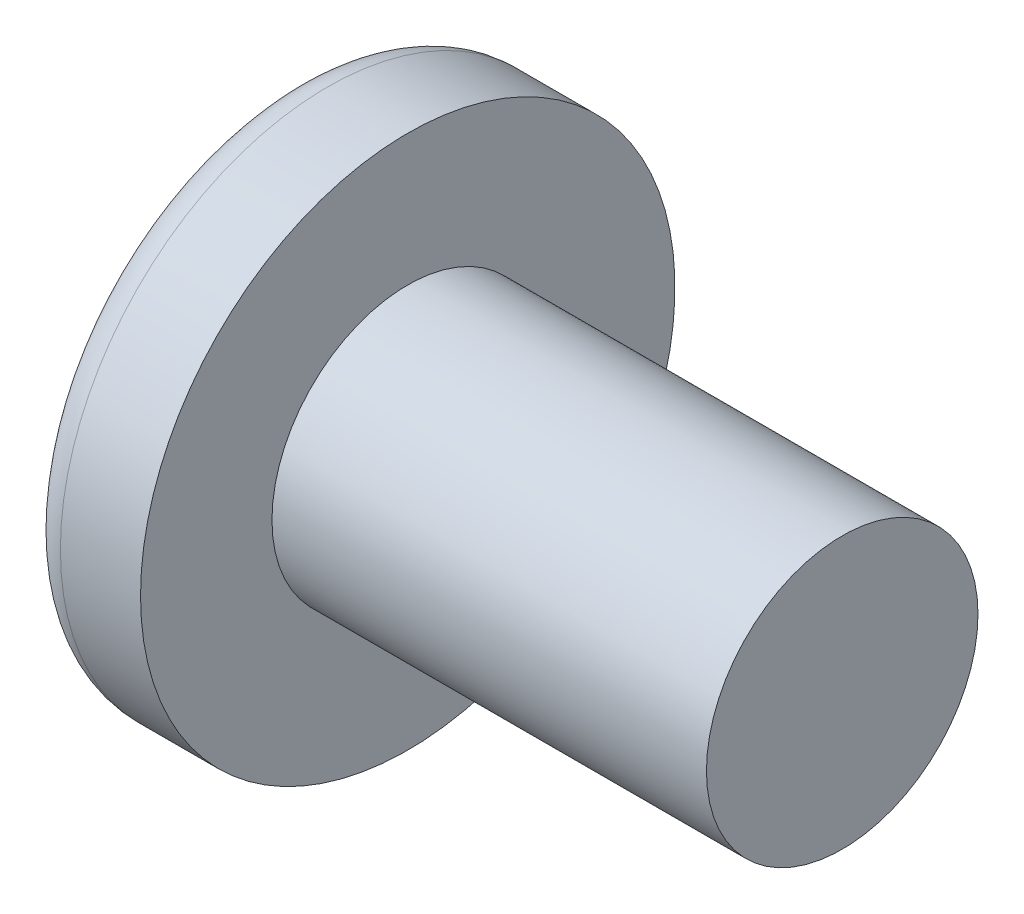
ISO-10303-21;
HEADER;
FILE_DESCRIPTION(('STEP AP214'),'2;1');
FILE_NAME('part.step','',(''),(''),'','','');
FILE_SCHEMA(('AUTOMOTIVE_DESIGN { 1 0 10303 214 1 1 1 1 }'));
ENDSEC;
DATA;
#1=APPLICATION_CONTEXT('core data for automotive mechanical design processes');
#2=APPLICATION_PROTOCOL_DEFINITION('international standard','automotive_design',2000,#1);
#3=PRODUCT_CONTEXT('',#1,'mechanical');
#4=PRODUCT('Part','Part','',(#3));
#5=PRODUCT_RELATED_PRODUCT_CATEGORY('part','',(#4));
#6=PRODUCT_DEFINITION_FORMATION('','',#4);
#7=PRODUCT_DEFINITION_CONTEXT('part definition',#1,'design');
#8=PRODUCT_DEFINITION('design','',#6,#7);
#9=PRODUCT_DEFINITION_SHAPE('','',#8);
#10=(LENGTH_UNIT() NAMED_UNIT(*) SI_UNIT(.MILLI.,.METRE.));
#11=(NAMED_UNIT(*) PLANE_ANGLE_UNIT() SI_UNIT($,.RADIAN.));
#12=(NAMED_UNIT(*) SI_UNIT($,.STERADIAN.) SOLID_ANGLE_UNIT());
#13=UNCERTAINTY_MEASURE_WITH_UNIT(LENGTH_MEASURE(1.E-05),#10,'distance_accuracy_value','');
#14=(GEOMETRIC_REPRESENTATION_CONTEXT(3) GLOBAL_UNCERTAINTY_ASSIGNED_CONTEXT((#13)) GLOBAL_UNIT_ASSIGNED_CONTEXT((#10,
#11,#12)) REPRESENTATION_CONTEXT('',''));
#15=CARTESIAN_POINT('',(0.,0.,0.));
#16=DIRECTION('',(0.,0.,1.));
#17=DIRECTION('',(1.,0.,0.));
#18=AXIS2_PLACEMENT_3D('',#15,#16,#17);
#19=CARTESIAN_POINT('',(12.7,0.,0.));
#20=DIRECTION('',(-1.,0.,0.));
#21=DIRECTION('',(0.,1.,0.));
#22=AXIS2_PLACEMENT_3D('',#19,#20,#21);
#23=SPHERICAL_SURFACE('',#22,12.7);
#24=CARTESIAN_POINT('',(2.36815802534129,0.,0.));
#25=DIRECTION('',(-1.,0.,0.));
#26=DIRECTION('',(0.,0.,1.));
#27=AXIS2_PLACEMENT_3D('',#24,#25,#26);
#28=CIRCLE('',#27,7.38532608695652);
#29=CARTESIAN_POINT('',(2.36815802534129,0.,7.38532608695652));
#30=VERTEX_POINT('',#29);
#31=EDGE_CURVE('E152',#30,#30,#28,.T.);
#32=ORIENTED_EDGE('',*,*,#31,.T.);
#33=EDGE_LOOP('',(#32));
#34=FACE_BOUND('',#33,.T.);
#35=CARTESIAN_POINT('',(12.6946475024373,-0.0716769238833038,0.));
#36=DIRECTION('',(-0.0744679815513389,-0.997223405122277,0.));
#37=DIRECTION('',(0.997223405122277,-0.0744679815513389,0.));
#38=AXIS2_PLACEMENT_3D('',#35,#36,#37);
#39=CIRCLE('',#38,12.6997966034639);
#40=CARTESIAN_POINT('',(0.812183571621758,0.815649928093165,4.39369272480246));
#41=VERTEX_POINT('',#40);
#42=CARTESIAN_POINT('',(0.0599897579314362,0.871820245349273,0.871820245349276));
#43=VERTEX_POINT('',#42);
#44=EDGE_CURVE('E183',#41,#43,#39,.T.);
#45=ORIENTED_EDGE('',*,*,#44,.F.);
#46=CARTESIAN_POINT('',(10.3179591199451,0.,-3.0442680126843));
#47=DIRECTION('',(0.616239312964625,0.,0.787558955987986));
#48=DIRECTION('',(0.787558955987986,0.,-0.616239312964625));
#49=AXIS2_PLACEMENT_3D('',#46,#47,#48);
#50=CIRCLE('',#49,12.0974507030487);
#51=CARTESIAN_POINT('',(0.81218357162176,-0.815649928093196,4.39369272480245));
#52=VERTEX_POINT('',#51);
#53=EDGE_CURVE('E148',#41,#52,#50,.T.);
#54=ORIENTED_EDGE('',*,*,#53,.T.);
#55=CARTESIAN_POINT('',(12.6946475024373,0.0716769238833032,0.));
#56=DIRECTION('',(-0.0744679815513388,0.997223405122277,0.));
#57=DIRECTION('',(-0.997223405122277,-0.0744679815513388,0.));
#58=AXIS2_PLACEMENT_3D('',#55,#56,#57);
#59=CIRCLE('',#58,12.6997966034639);
#60=CARTESIAN_POINT('',(0.0599897579314362,-0.871820245349278,0.871820245349275));
#61=VERTEX_POINT('',#60);
#62=EDGE_CURVE('E104',#61,#52,#59,.T.);
#63=ORIENTED_EDGE('',*,*,#62,.F.);
#64=CARTESIAN_POINT('',(12.6946475024373,0.,-0.0716769238833032));
#65=DIRECTION('',(-0.0744679815513388,0.,-0.997223405122277));
#66=DIRECTION('',(-0.997223405122277,0.,0.0744679815513388));
#67=AXIS2_PLACEMENT_3D('',#64,#65,#66);
#68=CIRCLE('',#67,12.6997966034639);
#69=CARTESIAN_POINT('',(0.81218357162176,-4.39369272480245,0.815649928093179));
#70=VERTEX_POINT('',#69);
#71=EDGE_CURVE('E129',#70,#61,#68,.T.);
#72=ORIENTED_EDGE('',*,*,#71,.F.);
#73=CARTESIAN_POINT('',(10.3179591199451,3.0442680126843,0.));
#74=DIRECTION('',(0.616239312964625,-0.787558955987986,0.));
#75=DIRECTION('',(0.787558955987986,0.616239312964625,0.));
#76=AXIS2_PLACEMENT_3D('',#73,#74,#75);
#77=CIRCLE('',#76,12.0974507030487);
#78=CARTESIAN_POINT('',(0.81218357162176,-4.39369272480245,-0.81564992809318));
#79=VERTEX_POINT('',#78);
#80=EDGE_CURVE('E137',#70,#79,#77,.T.);
#81=ORIENTED_EDGE('',*,*,#80,.T.);
#82=CARTESIAN_POINT('',(12.6946475024373,0.,0.0716769238833038));
#83=DIRECTION('',(-0.0744679815513389,0.,0.997223405122277));
#84=DIRECTION('',(0.997223405122277,0.,0.0744679815513389));
#85=AXIS2_PLACEMENT_3D('',#82,#83,#84);
#86=CIRCLE('',#85,12.6997966034639);
#87=CARTESIAN_POINT('',(0.0599897579314362,-0.871820245349272,-0.871820245349276));
#88=VERTEX_POINT('',#87);
#89=EDGE_CURVE('E47',#88,#79,#86,.T.);
#90=ORIENTED_EDGE('',*,*,#89,.F.);
#91=CARTESIAN_POINT('',(0.81218357162176,-0.815649928093164,-4.39369272480246));
#92=VERTEX_POINT('',#91);
#93=EDGE_CURVE('E190',#92,#88,#59,.T.);
#94=ORIENTED_EDGE('',*,*,#93,.F.);
#95=CARTESIAN_POINT('',(10.3179591199451,0.,3.0442680126843));
#96=DIRECTION('',(0.616239312964625,0.,-0.787558955987986));
#97=DIRECTION('',(-0.787558955987986,0.,-0.616239312964625));
#98=AXIS2_PLACEMENT_3D('',#95,#96,#97);
#99=CIRCLE('',#98,12.0974507030487);
#100=CARTESIAN_POINT('',(0.812183571621758,0.815649928093196,-4.39369272480245));
#101=VERTEX_POINT('',#100);
#102=EDGE_CURVE('E130',#92,#101,#99,.T.);
#103=ORIENTED_EDGE('',*,*,#102,.T.);
#104=CARTESIAN_POINT('',(0.0599897579314362,0.871820245349279,-0.871820245349276));
#105=VERTEX_POINT('',#104);
#106=EDGE_CURVE('E178',#105,#101,#39,.T.);
#107=ORIENTED_EDGE('',*,*,#106,.F.);
#108=CARTESIAN_POINT('',(0.812183571621758,4.39369272480245,-0.81564992809318));
#109=VERTEX_POINT('',#108);
#110=EDGE_CURVE('E40',#109,#105,#86,.T.);
#111=ORIENTED_EDGE('',*,*,#110,.F.);
#112=CARTESIAN_POINT('',(10.3179591199451,-3.0442680126843,0.));
#113=DIRECTION('',(0.616239312964625,0.787558955987986,0.));
#114=DIRECTION('',(-0.787558955987986,0.616239312964625,0.));
#115=AXIS2_PLACEMENT_3D('',#112,#113,#114);
#116=CIRCLE('',#115,12.0974507030487);
#117=CARTESIAN_POINT('',(0.81218357162176,4.39369272480245,0.81564992809318));
#118=VERTEX_POINT('',#117);
#119=EDGE_CURVE('E11',#109,#118,#116,.T.);
#120=ORIENTED_EDGE('',*,*,#119,.T.);
#121=EDGE_CURVE('E166',#43,#118,#68,.T.);
#122=ORIENTED_EDGE('',*,*,#121,.F.);
#123=EDGE_LOOP('',(#45,#54,#63,#72,#81,#90,#94,#103,#107,#111,#120,#122));
#124=FACE_BOUND('',#123,.T.);
#125=ADVANCED_FACE('F32',(#34,#124),#23,.T.);
#126=CARTESIAN_POINT('',(6.42735933609959,0.,-0.396334854771784));
#127=DIRECTION('',(-0.0744679815513389,0.,0.997223405122277));
#128=DIRECTION('',(0.997223405122277,0.,0.0744679815513389));
#129=AXIS2_PLACEMENT_3D('',#126,#127,#128);
#130=PLANE('',#129);
#131=ORIENTED_EDGE('',*,*,#110,.T.);
#132=DIRECTION('',(0.99446981098382,-0.0742623560150258,0.0742623560150255));
#133=VECTOR('',#132,1.);
#134=CARTESIAN_POINT('',(6.45662932745927,0.394149108663757,-0.394149108663756));
#135=LINE('',#134,#133);
#136=CARTESIAN_POINT('',(5.8674,0.438150000000002,-0.438149999999998));
#137=VERTEX_POINT('',#136);
#138=EDGE_CURVE('E172',#105,#137,#135,.T.);
#139=ORIENTED_EDGE('',*,*,#138,.T.);
#140=DIRECTION('',(0.786200490345469,-0.615176357705383,0.0587097768764474));
#141=VECTOR('',#140,1.);
#142=CARTESIAN_POINT('',(0.,5.0292,-0.8763));
#143=LINE('',#142,#141);
#144=EDGE_CURVE('E153',#109,#137,#143,.T.);
#145=ORIENTED_EDGE('',*,*,#144,.F.);
#146=EDGE_LOOP('',(#131,#139,#145));
#147=FACE_BOUND('',#146,.T.);
#148=ADVANCED_FACE('F171',(#147),#130,.T.);
#149=DIRECTION('',(0.786200490345469,0.615176357705383,0.0587097768764474));
#150=VECTOR('',#149,1.);
#151=CARTESIAN_POINT('',(0.,-5.0292,-0.8763));
#152=LINE('',#151,#150);
#153=CARTESIAN_POINT('',(5.8674,-0.43815,-0.43815));
#154=VERTEX_POINT('',#153);
#155=EDGE_CURVE('E138',#79,#154,#152,.T.);
#156=ORIENTED_EDGE('',*,*,#155,.T.);
#157=DIRECTION('',(-0.99446981098382,-0.0742623560150252,-0.0742623560150255));
#158=VECTOR('',#157,1.);
#159=CARTESIAN_POINT('',(6.45662932745927,-0.394149108663755,-0.394149108663756));
#160=LINE('',#159,#158);
#161=EDGE_CURVE('E193',#154,#88,#160,.T.);
#162=ORIENTED_EDGE('',*,*,#161,.T.);
#163=ORIENTED_EDGE('',*,*,#89,.T.);
#164=EDGE_LOOP('',(#156,#162,#163));
#165=FACE_BOUND('',#164,.T.);
#166=ADVANCED_FACE('F208',(#165),#130,.T.);
#167=CARTESIAN_POINT('',(6.42735933609959,0.,0.396334854771784));
#168=DIRECTION('',(-0.0744679815513388,0.,-0.997223405122277));
#169=DIRECTION('',(-0.997223405122277,0.,0.0744679815513388));
#170=AXIS2_PLACEMENT_3D('',#167,#168,#169);
#171=PLANE('',#170);
#172=DIRECTION('',(0.786200490345469,-0.615176357705383,-0.0587097768764474));
#173=VECTOR('',#172,1.);
#174=CARTESIAN_POINT('',(0.,5.0292,0.8763));
#175=LINE('',#174,#173);
#176=CARTESIAN_POINT('',(5.8674,0.43815,0.43815));
#177=VERTEX_POINT('',#176);
#178=EDGE_CURVE('E209',#118,#177,#175,.T.);
#179=ORIENTED_EDGE('',*,*,#178,.T.);
#180=DIRECTION('',(-0.99446981098382,0.0742623560150253,0.0742623560150255));
#181=VECTOR('',#180,1.);
#182=CARTESIAN_POINT('',(6.45662932745927,0.394149108663755,0.394149108663756));
#183=LINE('',#182,#181);
#184=EDGE_CURVE('E187',#177,#43,#183,.T.);
#185=ORIENTED_EDGE('',*,*,#184,.T.);
#186=ORIENTED_EDGE('',*,*,#121,.T.);
#187=EDGE_LOOP('',(#179,#185,#186));
#188=FACE_BOUND('',#187,.T.);
#189=ADVANCED_FACE('F213',(#188),#171,.T.);
#190=ORIENTED_EDGE('',*,*,#71,.T.);
#191=DIRECTION('',(0.99446981098382,0.0742623560150257,-0.0742623560150254));
#192=VECTOR('',#191,1.);
#193=CARTESIAN_POINT('',(6.45662932745927,-0.394149108663757,0.394149108663756));
#194=LINE('',#193,#192);
#195=CARTESIAN_POINT('',(5.8674,-0.438150000000002,0.438149999999998));
#196=VERTEX_POINT('',#195);
#197=EDGE_CURVE('E102',#61,#196,#194,.T.);
#198=ORIENTED_EDGE('',*,*,#197,.T.);
#199=DIRECTION('',(0.786200490345469,0.615176357705383,-0.0587097768764472));
#200=VECTOR('',#199,1.);
#201=CARTESIAN_POINT('',(0.,-5.0292,0.876299999999999));
#202=LINE('',#201,#200);
#203=EDGE_CURVE('E127',#70,#196,#202,.T.);
#204=ORIENTED_EDGE('',*,*,#203,.F.);
#205=EDGE_LOOP('',(#190,#198,#204));
#206=FACE_BOUND('',#205,.T.);
#207=ADVANCED_FACE('F126',(#206),#171,.T.);
#208=CARTESIAN_POINT('',(-25.4,0.,0.));
#209=DIRECTION('',(-1.,0.,0.));
#210=DIRECTION('',(0.,0.,1.));
#211=AXIS2_PLACEMENT_3D('',#208,#209,#210);
#212=CYLINDRICAL_SURFACE('',#211,3.96875);
#213=CARTESIAN_POINT('',(18.2372,0.,0.));
#214=DIRECTION('',(-1.,0.,0.));
#215=DIRECTION('',(0.,0.,1.));
#216=AXIS2_PLACEMENT_3D('',#213,#214,#215);
#217=CIRCLE('',#216,3.96875);
#218=CARTESIAN_POINT('',(18.2372,0.,3.96875));
#219=VERTEX_POINT('',#218);
#220=EDGE_CURVE('E149',#219,#219,#217,.T.);
#221=ORIENTED_EDGE('',*,*,#220,.T.);
#222=EDGE_LOOP('',(#221));
#223=FACE_BOUND('',#222,.T.);
#224=CARTESIAN_POINT('',(5.5372,0.,0.));
#225=DIRECTION('',(-1.,0.,0.));
#226=DIRECTION('',(0.,0.,1.));
#227=AXIS2_PLACEMENT_3D('',#224,#225,#226);
#228=CIRCLE('',#227,3.96875);
#229=CARTESIAN_POINT('',(5.5372,0.,3.96875));
#230=VERTEX_POINT('',#229);
#231=EDGE_CURVE('E162',#230,#230,#228,.T.);
#232=ORIENTED_EDGE('',*,*,#231,.F.);
#233=EDGE_LOOP('',(#232));
#234=FACE_BOUND('',#233,.T.);
#235=ADVANCED_FACE('F34',(#223,#234),#212,.T.);
#236=CARTESIAN_POINT('',(5.5372,3.96875,0.));
#237=DIRECTION('',(-1.,0.,0.));
#238=DIRECTION('',(0.,0.,1.));
#239=AXIS2_PLACEMENT_3D('',#236,#237,#238);
#240=PLANE('',#239);
#241=CARTESIAN_POINT('',(5.5372,0.,0.));
#242=DIRECTION('',(-1.,0.,0.));
#243=DIRECTION('',(0.,0.,1.));
#244=AXIS2_PLACEMENT_3D('',#241,#242,#243);
#245=CIRCLE('',#244,7.8105);
#246=CARTESIAN_POINT('',(5.5372,0.,7.8105));
#247=VERTEX_POINT('',#246);
#248=EDGE_CURVE('E159',#247,#247,#245,.T.);
#249=ORIENTED_EDGE('',*,*,#248,.F.);
#250=EDGE_LOOP('',(#249));
#251=FACE_BOUND('',#250,.T.);
#252=ORIENTED_EDGE('',*,*,#231,.T.);
#253=EDGE_LOOP('',(#252));
#254=FACE_BOUND('',#253,.T.);
#255=ADVANCED_FACE('F241',(#251,#254),#240,.F.);
#256=CARTESIAN_POINT('',(-25.4,0.,0.));
#257=DIRECTION('',(-1.,0.,0.));
#258=DIRECTION('',(0.,0.,1.));
#259=AXIS2_PLACEMENT_3D('',#256,#257,#258);
#260=CYLINDRICAL_SURFACE('',#259,7.8105);
#261=ORIENTED_EDGE('',*,*,#248,.T.);
#262=EDGE_LOOP('',(#261));
#263=FACE_BOUND('',#262,.T.);
#264=CARTESIAN_POINT('',(3.19470538331399,0.,0.));
#265=DIRECTION('',(-1.,0.,0.));
#266=DIRECTION('',(0.,0.,1.));
#267=AXIS2_PLACEMENT_3D('',#264,#265,#266);
#268=CIRCLE('',#267,7.8105);
#269=CARTESIAN_POINT('',(3.19470538331399,0.,7.8105));
#270=VERTEX_POINT('',#269);
#271=EDGE_CURVE('E156',#270,#270,#268,.T.);
#272=ORIENTED_EDGE('',*,*,#271,.F.);
#273=EDGE_LOOP('',(#272));
#274=FACE_BOUND('',#273,.T.);
#275=ADVANCED_FACE('F238',(#263,#274),#260,.T.);
#276=CARTESIAN_POINT('',(3.19470538331399,0.,0.));
#277=DIRECTION('',(-1.,0.,0.));
#278=DIRECTION('',(0.,0.,1.));
#279=AXIS2_PLACEMENT_3D('',#276,#277,#278);
#280=TOROIDAL_SURFACE('',#279,6.7945,1.016);
#281=ORIENTED_EDGE('',*,*,#271,.T.);
#282=EDGE_LOOP('',(#281));
#283=FACE_BOUND('',#282,.T.);
#284=ORIENTED_EDGE('',*,*,#31,.F.);
#285=EDGE_LOOP('',(#284));
#286=FACE_BOUND('',#285,.T.);
#287=ADVANCED_FACE('F235',(#283,#286),#280,.T.);
#288=CARTESIAN_POINT('',(18.2372,3.96875,0.));
#289=DIRECTION('',(1.,0.,0.));
#290=DIRECTION('',(0.,0.,-1.));
#291=AXIS2_PLACEMENT_3D('',#288,#289,#290);
#292=PLANE('',#291);
#293=ORIENTED_EDGE('',*,*,#220,.F.);
#294=EDGE_LOOP('',(#293));
#295=FACE_BOUND('',#294,.T.);
#296=ADVANCED_FACE('F233',(#295),#292,.T.);
#297=CARTESIAN_POINT('',(5.8674,0.43815,0.43815));
#298=DIRECTION('',(0.616239312964625,0.787558955987986,0.));
#299=DIRECTION('',(-0.787558955987986,0.616239312964625,0.));
#300=AXIS2_PLACEMENT_3D('',#297,#298,#299);
#301=PLANE('',#300);
#302=ORIENTED_EDGE('',*,*,#144,.T.);
#303=DIRECTION('',(0.,0.,-1.));
#304=VECTOR('',#303,1.);
#305=CARTESIAN_POINT('',(5.8674,0.43815,0.43815));
#306=LINE('',#305,#304);
#307=EDGE_CURVE('E120',#177,#137,#306,.T.);
#308=ORIENTED_EDGE('',*,*,#307,.F.);
#309=ORIENTED_EDGE('',*,*,#178,.F.);
#310=ORIENTED_EDGE('',*,*,#119,.F.);
#311=EDGE_LOOP('',(#302,#308,#309,#310));
#312=FACE_BOUND('',#311,.T.);
#313=ADVANCED_FACE('F212',(#312),#301,.F.);
#314=CARTESIAN_POINT('',(5.8674,-0.43815,-0.43815));
#315=DIRECTION('',(0.616239312964625,-0.787558955987986,0.));
#316=DIRECTION('',(0.787558955987986,0.616239312964625,0.));
#317=AXIS2_PLACEMENT_3D('',#314,#315,#316);
#318=PLANE('',#317);
#319=ORIENTED_EDGE('',*,*,#203,.T.);
#320=DIRECTION('',(0.,0.,1.));
#321=VECTOR('',#320,1.);
#322=CARTESIAN_POINT('',(5.8674,-0.43815,-0.43815));
#323=LINE('',#322,#321);
#324=EDGE_CURVE('E119',#154,#196,#323,.T.);
#325=ORIENTED_EDGE('',*,*,#324,.F.);
#326=ORIENTED_EDGE('',*,*,#155,.F.);
#327=ORIENTED_EDGE('',*,*,#80,.F.);
#328=EDGE_LOOP('',(#319,#325,#326,#327));
#329=FACE_BOUND('',#328,.T.);
#330=ADVANCED_FACE('F134',(#329),#318,.F.);
#331=CARTESIAN_POINT('',(5.8674,0.43815,-0.43815));
#332=DIRECTION('',(-1.,0.,0.));
#333=DIRECTION('',(0.,0.,1.));
#334=AXIS2_PLACEMENT_3D('',#331,#332,#333);
#335=PLANE('',#334);
#336=DIRECTION('',(0.,1.,0.));
#337=VECTOR('',#336,1.);
#338=CARTESIAN_POINT('',(5.8674,-0.43815,-0.43815));
#339=LINE('',#338,#337);
#340=EDGE_CURVE('E142',#154,#137,#339,.T.);
#341=ORIENTED_EDGE('',*,*,#340,.F.);
#342=ORIENTED_EDGE('',*,*,#324,.T.);
#343=DIRECTION('',(0.,-1.,0.));
#344=VECTOR('',#343,1.);
#345=CARTESIAN_POINT('',(5.8674,0.43815,0.43815));
#346=LINE('',#345,#344);
#347=EDGE_CURVE('E111',#177,#196,#346,.T.);
#348=ORIENTED_EDGE('',*,*,#347,.F.);
#349=ORIENTED_EDGE('',*,*,#307,.T.);
#350=EDGE_LOOP('',(#341,#342,#348,#349));
#351=FACE_BOUND('',#350,.T.);
#352=ADVANCED_FACE('F140',(#351),#335,.T.);
#353=CARTESIAN_POINT('',(5.8674,0.438150000000002,-0.438149999999998));
#354=DIRECTION('',(0.616239312964625,0.,-0.787558955987986));
#355=DIRECTION('',(0.787558955987986,0.,0.616239312964625));
#356=AXIS2_PLACEMENT_3D('',#353,#354,#355);
#357=PLANE('',#356);
#358=DIRECTION('',(0.786200490345469,0.0587097768764451,0.615176357705383));
#359=VECTOR('',#358,1.);
#360=CARTESIAN_POINT('',(0.,-0.876299999999981,-5.0292));
#361=LINE('',#360,#359);
#362=EDGE_CURVE('E198',#92,#154,#361,.T.);
#363=ORIENTED_EDGE('',*,*,#362,.T.);
#364=ORIENTED_EDGE('',*,*,#340,.T.);
#365=DIRECTION('',(0.786200490345469,-0.0587097768764495,0.615176357705383));
#366=VECTOR('',#365,1.);
#367=CARTESIAN_POINT('',(0.,0.876300000000018,-5.0292));
#368=LINE('',#367,#366);
#369=EDGE_CURVE('E108',#101,#137,#368,.T.);
#370=ORIENTED_EDGE('',*,*,#369,.F.);
#371=ORIENTED_EDGE('',*,*,#102,.F.);
#372=EDGE_LOOP('',(#363,#364,#370,#371));
#373=FACE_BOUND('',#372,.T.);
#374=ADVANCED_FACE('F203',(#373),#357,.F.);
#375=CARTESIAN_POINT('',(6.42735933609959,-0.396334854771784,0.));
#376=DIRECTION('',(-0.0744679815513388,0.997223405122277,0.));
#377=DIRECTION('',(-0.997223405122277,-0.0744679815513388,0.));
#378=AXIS2_PLACEMENT_3D('',#375,#376,#377);
#379=PLANE('',#378);
#380=ORIENTED_EDGE('',*,*,#93,.T.);
#381=ORIENTED_EDGE('',*,*,#161,.F.);
#382=ORIENTED_EDGE('',*,*,#362,.F.);
#383=EDGE_LOOP('',(#380,#381,#382));
#384=FACE_BOUND('',#383,.T.);
#385=ADVANCED_FACE('F207',(#384),#379,.T.);
#386=CARTESIAN_POINT('',(6.42735933609959,0.396334854771784,0.));
#387=DIRECTION('',(-0.0744679815513389,-0.997223405122277,0.));
#388=DIRECTION('',(0.997223405122277,-0.0744679815513389,0.));
#389=AXIS2_PLACEMENT_3D('',#386,#387,#388);
#390=PLANE('',#389);
#391=ORIENTED_EDGE('',*,*,#106,.T.);
#392=ORIENTED_EDGE('',*,*,#369,.T.);
#393=ORIENTED_EDGE('',*,*,#138,.F.);
#394=EDGE_LOOP('',(#391,#392,#393));
#395=FACE_BOUND('',#394,.T.);
#396=ADVANCED_FACE('F201',(#395),#390,.T.);
#397=CARTESIAN_POINT('',(5.8674,-0.438150000000002,0.438149999999998));
#398=DIRECTION('',(0.616239312964625,0.,0.787558955987986));
#399=DIRECTION('',(-0.787558955987986,0.,0.616239312964625));
#400=AXIS2_PLACEMENT_3D('',#397,#398,#399);
#401=PLANE('',#400);
#402=DIRECTION('',(0.786200490345469,-0.0587097768764452,-0.615176357705383));
#403=VECTOR('',#402,1.);
#404=CARTESIAN_POINT('',(0.,0.876299999999982,5.0292));
#405=LINE('',#404,#403);
#406=EDGE_CURVE('E107',#41,#177,#405,.T.);
#407=ORIENTED_EDGE('',*,*,#406,.T.);
#408=ORIENTED_EDGE('',*,*,#347,.T.);
#409=DIRECTION('',(0.786200490345469,0.0587097768764495,-0.615176357705383));
#410=VECTOR('',#409,1.);
#411=CARTESIAN_POINT('',(0.,-0.876300000000018,5.0292));
#412=LINE('',#411,#410);
#413=EDGE_CURVE('E98',#52,#196,#412,.T.);
#414=ORIENTED_EDGE('',*,*,#413,.F.);
#415=ORIENTED_EDGE('',*,*,#53,.F.);
#416=EDGE_LOOP('',(#407,#408,#414,#415));
#417=FACE_BOUND('',#416,.T.);
#418=ADVANCED_FACE('F112',(#417),#401,.F.);
#419=ORIENTED_EDGE('',*,*,#44,.T.);
#420=ORIENTED_EDGE('',*,*,#184,.F.);
#421=ORIENTED_EDGE('',*,*,#406,.F.);
#422=EDGE_LOOP('',(#419,#420,#421));
#423=FACE_BOUND('',#422,.T.);
#424=ADVANCED_FACE('F214',(#423),#390,.T.);
#425=ORIENTED_EDGE('',*,*,#62,.T.);
#426=ORIENTED_EDGE('',*,*,#413,.T.);
#427=ORIENTED_EDGE('',*,*,#197,.F.);
#428=EDGE_LOOP('',(#425,#426,#427));
#429=FACE_BOUND('',#428,.T.);
#430=ADVANCED_FACE('F100',(#429),#379,.T.);
#431=CLOSED_SHELL('',(#125,#148,#166,#189,#207,#235,#255,#275,#287,#296,#313,#330,#352,#374,
#385,#396,#418,#424,#430));
#432=MANIFOLD_SOLID_BREP('B2',#431);
#433=ADVANCED_BREP_SHAPE_REPRESENTATION('',(#18,#432),#14);
#434=SHAPE_DEFINITION_REPRESENTATION(#9,#433);
ENDSEC;
END-ISO-10303-21;
